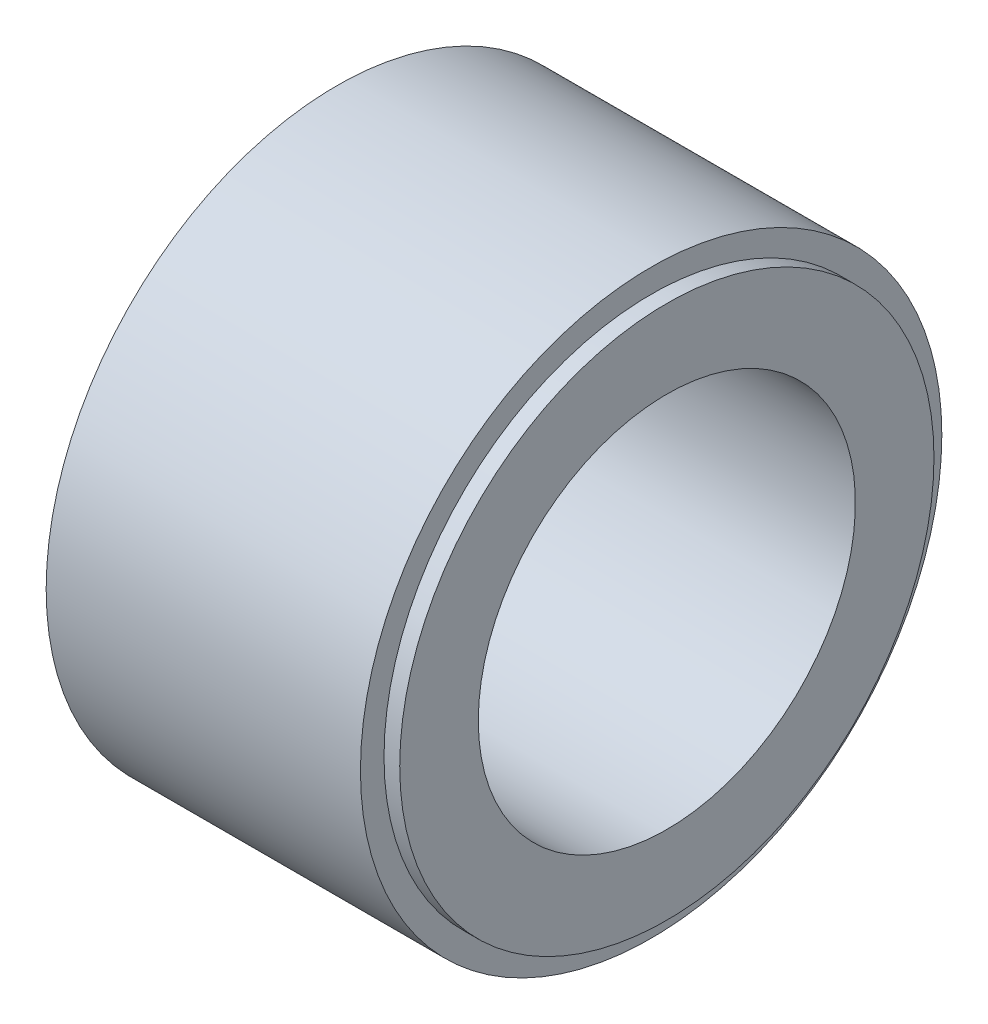
ISO-10303-21;
HEADER;
FILE_DESCRIPTION(('STEP AP214'),'2;1');
FILE_NAME('part.step','',(''),(''),'','','');
FILE_SCHEMA(('AUTOMOTIVE_DESIGN { 1 0 10303 214 1 1 1 1 }'));
ENDSEC;
DATA;
#1=APPLICATION_CONTEXT('core data for automotive mechanical design processes');
#2=APPLICATION_PROTOCOL_DEFINITION('international standard','automotive_design',2000,#1);
#3=PRODUCT_CONTEXT('',#1,'mechanical');
#4=PRODUCT('Part','Part','',(#3));
#5=PRODUCT_RELATED_PRODUCT_CATEGORY('part','',(#4));
#6=PRODUCT_DEFINITION_FORMATION('','',#4);
#7=PRODUCT_DEFINITION_CONTEXT('part definition',#1,'design');
#8=PRODUCT_DEFINITION('design','',#6,#7);
#9=PRODUCT_DEFINITION_SHAPE('','',#8);
#10=(LENGTH_UNIT() NAMED_UNIT(*) SI_UNIT(.MILLI.,.METRE.));
#11=(NAMED_UNIT(*) PLANE_ANGLE_UNIT() SI_UNIT($,.RADIAN.));
#12=(NAMED_UNIT(*) SI_UNIT($,.STERADIAN.) SOLID_ANGLE_UNIT());
#13=UNCERTAINTY_MEASURE_WITH_UNIT(LENGTH_MEASURE(1.E-05),#10,'distance_accuracy_value','');
#14=(GEOMETRIC_REPRESENTATION_CONTEXT(3) GLOBAL_UNCERTAINTY_ASSIGNED_CONTEXT((#13)) GLOBAL_UNIT_ASSIGNED_CONTEXT((#10,
#11,#12)) REPRESENTATION_CONTEXT('',''));
#15=CARTESIAN_POINT('',(0.,0.,0.));
#16=DIRECTION('',(0.,0.,1.));
#17=DIRECTION('',(1.,0.,0.));
#18=AXIS2_PLACEMENT_3D('',#15,#16,#17);
#19=CARTESIAN_POINT('',(0.,0.,0.));
#20=DIRECTION('',(-1.,0.,0.));
#21=DIRECTION('',(0.,0.,1.));
#22=AXIS2_PLACEMENT_3D('',#19,#20,#21);
#23=CYLINDRICAL_SURFACE('',#22,24.);
#24=CARTESIAN_POINT('',(44.,0.,0.));
#25=DIRECTION('',(-1.,0.,0.));
#26=DIRECTION('',(0.,0.,1.));
#27=AXIS2_PLACEMENT_3D('',#24,#25,#26);
#28=CIRCLE('',#27,24.);
#29=CARTESIAN_POINT('',(44.,0.,24.));
#30=VERTEX_POINT('',#29);
#31=EDGE_CURVE('E53',#30,#30,#28,.T.);
#32=ORIENTED_EDGE('',*,*,#31,.F.);
#33=EDGE_LOOP('',(#32));
#34=FACE_BOUND('',#33,.T.);
#35=CARTESIAN_POINT('',(4.,0.,0.));
#36=DIRECTION('',(-1.,0.,0.));
#37=DIRECTION('',(0.,0.,1.));
#38=AXIS2_PLACEMENT_3D('',#35,#36,#37);
#39=CIRCLE('',#38,24.);
#40=CARTESIAN_POINT('',(4.,0.,24.));
#41=VERTEX_POINT('',#40);
#42=EDGE_CURVE('E12',#41,#41,#39,.F.);
#43=ORIENTED_EDGE('',*,*,#42,.F.);
#44=EDGE_LOOP('',(#43));
#45=FACE_BOUND('',#44,.T.);
#46=ADVANCED_FACE('F42',(#34,#45),#23,.F.);
#47=CARTESIAN_POINT('',(0.,0.,0.));
#48=DIRECTION('',(-1.,0.,0.));
#49=DIRECTION('',(0.,0.,1.));
#50=AXIS2_PLACEMENT_3D('',#47,#48,#49);
#51=CYLINDRICAL_SURFACE('',#50,34.);
#52=CARTESIAN_POINT('',(0.,0.,0.));
#53=DIRECTION('',(-1.,0.,0.));
#54=DIRECTION('',(0.,0.,1.));
#55=AXIS2_PLACEMENT_3D('',#52,#53,#54);
#56=CIRCLE('',#55,34.);
#57=CARTESIAN_POINT('',(0.,0.,34.));
#58=VERTEX_POINT('',#57);
#59=EDGE_CURVE('E49',#58,#58,#56,.T.);
#60=ORIENTED_EDGE('',*,*,#59,.F.);
#61=EDGE_LOOP('',(#60));
#62=FACE_BOUND('',#61,.T.);
#63=CARTESIAN_POINT('',(2.,0.,0.));
#64=DIRECTION('',(1.,0.,0.));
#65=DIRECTION('',(0.,0.,-1.));
#66=AXIS2_PLACEMENT_3D('',#63,#64,#65);
#67=CIRCLE('',#66,34.);
#68=CARTESIAN_POINT('',(2.,0.,-34.));
#69=VERTEX_POINT('',#68);
#70=EDGE_CURVE('E65',#69,#69,#67,.T.);
#71=ORIENTED_EDGE('',*,*,#70,.F.);
#72=EDGE_LOOP('',(#71));
#73=FACE_BOUND('',#72,.T.);
#74=ADVANCED_FACE('F44',(#62,#73),#51,.T.);
#75=CARTESIAN_POINT('',(0.,24.,0.));
#76=DIRECTION('',(1.,0.,0.));
#77=DIRECTION('',(0.,0.,-1.));
#78=AXIS2_PLACEMENT_3D('',#75,#76,#77);
#79=PLANE('',#78);
#80=ORIENTED_EDGE('',*,*,#59,.T.);
#81=EDGE_LOOP('',(#80));
#82=FACE_BOUND('',#81,.T.);
#83=CARTESIAN_POINT('',(0.,16.4544826719043,9.49999999999999));
#84=DIRECTION('',(-1.,0.,0.));
#85=DIRECTION('',(0.,0.,1.));
#86=AXIS2_PLACEMENT_3D('',#83,#84,#85);
#87=CIRCLE('',#86,4.);
#88=CARTESIAN_POINT('',(0.,16.4544826719043,13.5));
#89=VERTEX_POINT('',#88);
#90=EDGE_CURVE('E111',#89,#89,#87,.T.);
#91=ORIENTED_EDGE('',*,*,#90,.F.);
#92=EDGE_LOOP('',(#91));
#93=FACE_BOUND('',#92,.T.);
#94=CARTESIAN_POINT('',(0.,16.4544826719043,-9.50000000000001));
#95=DIRECTION('',(-1.,0.,0.));
#96=DIRECTION('',(0.,0.,1.));
#97=AXIS2_PLACEMENT_3D('',#94,#95,#96);
#98=CIRCLE('',#97,4.);
#99=CARTESIAN_POINT('',(0.,16.4544826719043,-5.50000000000001));
#100=VERTEX_POINT('',#99);
#101=EDGE_CURVE('E105',#100,#100,#98,.T.);
#102=ORIENTED_EDGE('',*,*,#101,.F.);
#103=EDGE_LOOP('',(#102));
#104=FACE_BOUND('',#103,.T.);
#105=CARTESIAN_POINT('',(0.,0.,-19.));
#106=DIRECTION('',(-1.,0.,0.));
#107=DIRECTION('',(0.,0.,1.));
#108=AXIS2_PLACEMENT_3D('',#105,#106,#107);
#109=CIRCLE('',#108,3.99999999999999);
#110=CARTESIAN_POINT('',(0.,0.,-15.));
#111=VERTEX_POINT('',#110);
#112=EDGE_CURVE('E99',#111,#111,#109,.T.);
#113=ORIENTED_EDGE('',*,*,#112,.F.);
#114=EDGE_LOOP('',(#113));
#115=FACE_BOUND('',#114,.T.);
#116=CARTESIAN_POINT('',(0.,-16.4544826719043,-9.5));
#117=DIRECTION('',(-1.,0.,0.));
#118=DIRECTION('',(0.,0.,1.));
#119=AXIS2_PLACEMENT_3D('',#116,#117,#118);
#120=CIRCLE('',#119,4.);
#121=CARTESIAN_POINT('',(0.,-16.4544826719043,-5.5));
#122=VERTEX_POINT('',#121);
#123=EDGE_CURVE('E93',#122,#122,#120,.T.);
#124=ORIENTED_EDGE('',*,*,#123,.F.);
#125=EDGE_LOOP('',(#124));
#126=FACE_BOUND('',#125,.T.);
#127=CARTESIAN_POINT('',(0.,-16.4544826719043,9.5));
#128=DIRECTION('',(-1.,0.,0.));
#129=DIRECTION('',(0.,0.,1.));
#130=AXIS2_PLACEMENT_3D('',#127,#128,#129);
#131=CIRCLE('',#130,4.);
#132=CARTESIAN_POINT('',(0.,-16.4544826719043,13.5));
#133=VERTEX_POINT('',#132);
#134=EDGE_CURVE('E87',#133,#133,#131,.T.);
#135=ORIENTED_EDGE('',*,*,#134,.F.);
#136=EDGE_LOOP('',(#135));
#137=FACE_BOUND('',#136,.T.);
#138=CARTESIAN_POINT('',(0.,0.,0.));
#139=DIRECTION('',(-1.,0.,0.));
#140=DIRECTION('',(0.,0.,1.));
#141=AXIS2_PLACEMENT_3D('',#138,#139,#140);
#142=CIRCLE('',#141,3.);
#143=CARTESIAN_POINT('',(0.,0.,3.));
#144=VERTEX_POINT('',#143);
#145=EDGE_CURVE('E81',#144,#144,#142,.T.);
#146=ORIENTED_EDGE('',*,*,#145,.F.);
#147=EDGE_LOOP('',(#146));
#148=FACE_BOUND('',#147,.T.);
#149=CARTESIAN_POINT('',(0.,0.,19.));
#150=DIRECTION('',(-1.,0.,0.));
#151=DIRECTION('',(0.,0.,1.));
#152=AXIS2_PLACEMENT_3D('',#149,#150,#151);
#153=CIRCLE('',#152,4.);
#154=CARTESIAN_POINT('',(0.,0.,23.));
#155=VERTEX_POINT('',#154);
#156=EDGE_CURVE('E75',#155,#155,#153,.T.);
#157=ORIENTED_EDGE('',*,*,#156,.F.);
#158=EDGE_LOOP('',(#157));
#159=FACE_BOUND('',#158,.T.);
#160=ADVANCED_FACE('F127',(#82,#93,#104,#115,#126,#137,#148,#159),#79,.F.);
#161=CARTESIAN_POINT('',(44.,34.,0.));
#162=DIRECTION('',(-1.,0.,0.));
#163=DIRECTION('',(0.,0.,1.));
#164=AXIS2_PLACEMENT_3D('',#161,#162,#163);
#165=PLANE('',#164);
#166=CARTESIAN_POINT('',(44.,0.,0.));
#167=DIRECTION('',(-1.,0.,0.));
#168=DIRECTION('',(0.,0.,1.));
#169=AXIS2_PLACEMENT_3D('',#166,#167,#168);
#170=CIRCLE('',#169,34.);
#171=CARTESIAN_POINT('',(44.,0.,34.));
#172=VERTEX_POINT('',#171);
#173=EDGE_CURVE('E57',#172,#172,#170,.T.);
#174=ORIENTED_EDGE('',*,*,#173,.F.);
#175=EDGE_LOOP('',(#174));
#176=FACE_BOUND('',#175,.T.);
#177=ORIENTED_EDGE('',*,*,#31,.T.);
#178=EDGE_LOOP('',(#177));
#179=FACE_BOUND('',#178,.T.);
#180=ADVANCED_FACE('F130',(#176,#179),#165,.F.);
#181=CARTESIAN_POINT('',(0.,0.,0.));
#182=DIRECTION('',(-1.,0.,0.));
#183=DIRECTION('',(0.,0.,1.));
#184=AXIS2_PLACEMENT_3D('',#181,#182,#183);
#185=CYLINDRICAL_SURFACE('',#184,34.);
#186=CARTESIAN_POINT('',(42.,0.,0.));
#187=DIRECTION('',(-1.,0.,0.));
#188=DIRECTION('',(0.,0.,1.));
#189=AXIS2_PLACEMENT_3D('',#186,#187,#188);
#190=CIRCLE('',#189,34.);
#191=CARTESIAN_POINT('',(42.,0.,34.));
#192=VERTEX_POINT('',#191);
#193=EDGE_CURVE('E62',#192,#192,#190,.T.);
#194=ORIENTED_EDGE('',*,*,#193,.F.);
#195=EDGE_LOOP('',(#194));
#196=FACE_BOUND('',#195,.T.);
#197=ORIENTED_EDGE('',*,*,#173,.T.);
#198=EDGE_LOOP('',(#197));
#199=FACE_BOUND('',#198,.T.);
#200=ADVANCED_FACE('F170',(#196,#199),#185,.T.);
#201=CARTESIAN_POINT('',(42.,30.,0.));
#202=DIRECTION('',(-1.,0.,0.));
#203=DIRECTION('',(0.,0.,1.));
#204=AXIS2_PLACEMENT_3D('',#201,#202,#203);
#205=PLANE('',#204);
#206=CARTESIAN_POINT('',(42.,0.,0.));
#207=DIRECTION('',(-1.,0.,0.));
#208=DIRECTION('',(0.,0.,1.));
#209=AXIS2_PLACEMENT_3D('',#206,#207,#208);
#210=CIRCLE('',#209,37.);
#211=CARTESIAN_POINT('',(42.,0.,37.));
#212=VERTEX_POINT('',#211);
#213=EDGE_CURVE('E71',#212,#212,#210,.T.);
#214=ORIENTED_EDGE('',*,*,#213,.F.);
#215=EDGE_LOOP('',(#214));
#216=FACE_BOUND('',#215,.T.);
#217=ORIENTED_EDGE('',*,*,#193,.T.);
#218=EDGE_LOOP('',(#217));
#219=FACE_BOUND('',#218,.T.);
#220=ADVANCED_FACE('F174',(#216,#219),#205,.F.);
#221=CARTESIAN_POINT('',(2.,34.,0.));
#222=DIRECTION('',(1.,0.,0.));
#223=DIRECTION('',(0.,0.,-1.));
#224=AXIS2_PLACEMENT_3D('',#221,#222,#223);
#225=PLANE('',#224);
#226=CARTESIAN_POINT('',(2.,0.,0.));
#227=DIRECTION('',(-1.,0.,0.));
#228=DIRECTION('',(0.,0.,1.));
#229=AXIS2_PLACEMENT_3D('',#226,#227,#228);
#230=CIRCLE('',#229,37.);
#231=CARTESIAN_POINT('',(2.,0.,37.));
#232=VERTEX_POINT('',#231);
#233=EDGE_CURVE('E68',#232,#232,#230,.T.);
#234=ORIENTED_EDGE('',*,*,#233,.T.);
#235=EDGE_LOOP('',(#234));
#236=FACE_BOUND('',#235,.T.);
#237=ORIENTED_EDGE('',*,*,#70,.T.);
#238=EDGE_LOOP('',(#237));
#239=FACE_BOUND('',#238,.T.);
#240=ADVANCED_FACE('F178',(#236,#239),#225,.F.);
#241=CARTESIAN_POINT('',(0.,0.,0.));
#242=DIRECTION('',(-1.,0.,0.));
#243=DIRECTION('',(0.,0.,1.));
#244=AXIS2_PLACEMENT_3D('',#241,#242,#243);
#245=CYLINDRICAL_SURFACE('',#244,37.);
#246=ORIENTED_EDGE('',*,*,#233,.F.);
#247=EDGE_LOOP('',(#246));
#248=FACE_BOUND('',#247,.T.);
#249=ORIENTED_EDGE('',*,*,#213,.T.);
#250=EDGE_LOOP('',(#249));
#251=FACE_BOUND('',#250,.T.);
#252=ADVANCED_FACE('F155',(#248,#251),#245,.T.);
#253=CARTESIAN_POINT('',(4.,0.,0.));
#254=DIRECTION('',(-1.,0.,0.));
#255=DIRECTION('',(0.,0.,1.));
#256=AXIS2_PLACEMENT_3D('',#253,#254,#255);
#257=PLANE('',#256);
#258=CARTESIAN_POINT('',(4.,16.4544826719043,9.49999999999999));
#259=DIRECTION('',(-1.,0.,0.));
#260=DIRECTION('',(0.,0.,1.));
#261=AXIS2_PLACEMENT_3D('',#258,#259,#260);
#262=CIRCLE('',#261,4.);
#263=CARTESIAN_POINT('',(4.,16.4544826719043,13.5));
#264=VERTEX_POINT('',#263);
#265=EDGE_CURVE('E108',#264,#264,#262,.T.);
#266=ORIENTED_EDGE('',*,*,#265,.T.);
#267=EDGE_LOOP('',(#266));
#268=FACE_BOUND('',#267,.T.);
#269=CARTESIAN_POINT('',(4.,16.4544826719043,-9.50000000000001));
#270=DIRECTION('',(-1.,0.,0.));
#271=DIRECTION('',(0.,0.,1.));
#272=AXIS2_PLACEMENT_3D('',#269,#270,#271);
#273=CIRCLE('',#272,4.);
#274=CARTESIAN_POINT('',(4.,16.4544826719043,-5.50000000000001));
#275=VERTEX_POINT('',#274);
#276=EDGE_CURVE('E102',#275,#275,#273,.T.);
#277=ORIENTED_EDGE('',*,*,#276,.T.);
#278=EDGE_LOOP('',(#277));
#279=FACE_BOUND('',#278,.T.);
#280=CARTESIAN_POINT('',(4.,0.,-19.));
#281=DIRECTION('',(-1.,0.,0.));
#282=DIRECTION('',(0.,0.,1.));
#283=AXIS2_PLACEMENT_3D('',#280,#281,#282);
#284=CIRCLE('',#283,3.99999999999999);
#285=CARTESIAN_POINT('',(4.,0.,-15.));
#286=VERTEX_POINT('',#285);
#287=EDGE_CURVE('E96',#286,#286,#284,.T.);
#288=ORIENTED_EDGE('',*,*,#287,.T.);
#289=EDGE_LOOP('',(#288));
#290=FACE_BOUND('',#289,.T.);
#291=CARTESIAN_POINT('',(4.,-16.4544826719043,-9.5));
#292=DIRECTION('',(-1.,0.,0.));
#293=DIRECTION('',(0.,0.,1.));
#294=AXIS2_PLACEMENT_3D('',#291,#292,#293);
#295=CIRCLE('',#294,4.);
#296=CARTESIAN_POINT('',(4.,-16.4544826719043,-5.5));
#297=VERTEX_POINT('',#296);
#298=EDGE_CURVE('E90',#297,#297,#295,.T.);
#299=ORIENTED_EDGE('',*,*,#298,.T.);
#300=EDGE_LOOP('',(#299));
#301=FACE_BOUND('',#300,.T.);
#302=CARTESIAN_POINT('',(4.,-16.4544826719043,9.5));
#303=DIRECTION('',(-1.,0.,0.));
#304=DIRECTION('',(0.,0.,1.));
#305=AXIS2_PLACEMENT_3D('',#302,#303,#304);
#306=CIRCLE('',#305,4.);
#307=CARTESIAN_POINT('',(4.,-16.4544826719043,13.5));
#308=VERTEX_POINT('',#307);
#309=EDGE_CURVE('E84',#308,#308,#306,.T.);
#310=ORIENTED_EDGE('',*,*,#309,.T.);
#311=EDGE_LOOP('',(#310));
#312=FACE_BOUND('',#311,.T.);
#313=CARTESIAN_POINT('',(4.,0.,0.));
#314=DIRECTION('',(-1.,0.,0.));
#315=DIRECTION('',(0.,0.,1.));
#316=AXIS2_PLACEMENT_3D('',#313,#314,#315);
#317=CIRCLE('',#316,3.);
#318=CARTESIAN_POINT('',(4.,0.,3.));
#319=VERTEX_POINT('',#318);
#320=EDGE_CURVE('E78',#319,#319,#317,.T.);
#321=ORIENTED_EDGE('',*,*,#320,.T.);
#322=EDGE_LOOP('',(#321));
#323=FACE_BOUND('',#322,.T.);
#324=CARTESIAN_POINT('',(4.,0.,19.));
#325=DIRECTION('',(-1.,0.,0.));
#326=DIRECTION('',(0.,0.,1.));
#327=AXIS2_PLACEMENT_3D('',#324,#325,#326);
#328=CIRCLE('',#327,4.);
#329=CARTESIAN_POINT('',(4.,0.,23.));
#330=VERTEX_POINT('',#329);
#331=EDGE_CURVE('E74',#330,#330,#328,.T.);
#332=ORIENTED_EDGE('',*,*,#331,.T.);
#333=EDGE_LOOP('',(#332));
#334=FACE_BOUND('',#333,.T.);
#335=ORIENTED_EDGE('',*,*,#42,.T.);
#336=EDGE_LOOP('',(#335));
#337=FACE_BOUND('',#336,.T.);
#338=ADVANCED_FACE('F117',(#268,#279,#290,#301,#312,#323,#334,#337),#257,.F.);
#339=CARTESIAN_POINT('',(4.,0.,19.));
#340=DIRECTION('',(-1.,0.,0.));
#341=DIRECTION('',(0.,0.,1.));
#342=AXIS2_PLACEMENT_3D('',#339,#340,#341);
#343=CYLINDRICAL_SURFACE('',#342,4.);
#344=ORIENTED_EDGE('',*,*,#331,.F.);
#345=EDGE_LOOP('',(#344));
#346=FACE_BOUND('',#345,.T.);
#347=ORIENTED_EDGE('',*,*,#156,.T.);
#348=EDGE_LOOP('',(#347));
#349=FACE_BOUND('',#348,.T.);
#350=ADVANCED_FACE('F143',(#346,#349),#343,.F.);
#351=CARTESIAN_POINT('',(4.,0.,0.));
#352=DIRECTION('',(-1.,0.,0.));
#353=DIRECTION('',(0.,0.,1.));
#354=AXIS2_PLACEMENT_3D('',#351,#352,#353);
#355=CYLINDRICAL_SURFACE('',#354,3.);
#356=ORIENTED_EDGE('',*,*,#320,.F.);
#357=EDGE_LOOP('',(#356));
#358=FACE_BOUND('',#357,.T.);
#359=ORIENTED_EDGE('',*,*,#145,.T.);
#360=EDGE_LOOP('',(#359));
#361=FACE_BOUND('',#360,.T.);
#362=ADVANCED_FACE('F145',(#358,#361),#355,.F.);
#363=CARTESIAN_POINT('',(4.,-16.4544826719043,9.5));
#364=DIRECTION('',(-1.,0.,0.));
#365=DIRECTION('',(0.,0.,1.));
#366=AXIS2_PLACEMENT_3D('',#363,#364,#365);
#367=CYLINDRICAL_SURFACE('',#366,4.);
#368=ORIENTED_EDGE('',*,*,#309,.F.);
#369=EDGE_LOOP('',(#368));
#370=FACE_BOUND('',#369,.T.);
#371=ORIENTED_EDGE('',*,*,#134,.T.);
#372=EDGE_LOOP('',(#371));
#373=FACE_BOUND('',#372,.T.);
#374=ADVANCED_FACE('F152',(#370,#373),#367,.F.);
#375=CARTESIAN_POINT('',(4.,-16.4544826719043,-9.5));
#376=DIRECTION('',(-1.,0.,0.));
#377=DIRECTION('',(0.,0.,1.));
#378=AXIS2_PLACEMENT_3D('',#375,#376,#377);
#379=CYLINDRICAL_SURFACE('',#378,4.);
#380=ORIENTED_EDGE('',*,*,#298,.F.);
#381=EDGE_LOOP('',(#380));
#382=FACE_BOUND('',#381,.T.);
#383=ORIENTED_EDGE('',*,*,#123,.T.);
#384=EDGE_LOOP('',(#383));
#385=FACE_BOUND('',#384,.T.);
#386=ADVANCED_FACE('F230',(#382,#385),#379,.F.);
#387=CARTESIAN_POINT('',(4.,0.,-19.));
#388=DIRECTION('',(-1.,0.,0.));
#389=DIRECTION('',(0.,0.,1.));
#390=AXIS2_PLACEMENT_3D('',#387,#388,#389);
#391=CYLINDRICAL_SURFACE('',#390,3.99999999999999);
#392=ORIENTED_EDGE('',*,*,#287,.F.);
#393=EDGE_LOOP('',(#392));
#394=FACE_BOUND('',#393,.T.);
#395=ORIENTED_EDGE('',*,*,#112,.T.);
#396=EDGE_LOOP('',(#395));
#397=FACE_BOUND('',#396,.T.);
#398=ADVANCED_FACE('F240',(#394,#397),#391,.F.);
#399=CARTESIAN_POINT('',(4.,16.4544826719043,-9.50000000000001));
#400=DIRECTION('',(-1.,0.,0.));
#401=DIRECTION('',(0.,0.,1.));
#402=AXIS2_PLACEMENT_3D('',#399,#400,#401);
#403=CYLINDRICAL_SURFACE('',#402,4.);
#404=ORIENTED_EDGE('',*,*,#276,.F.);
#405=EDGE_LOOP('',(#404));
#406=FACE_BOUND('',#405,.T.);
#407=ORIENTED_EDGE('',*,*,#101,.T.);
#408=EDGE_LOOP('',(#407));
#409=FACE_BOUND('',#408,.T.);
#410=ADVANCED_FACE('F123',(#406,#409),#403,.F.);
#411=CARTESIAN_POINT('',(4.,16.4544826719043,9.49999999999999));
#412=DIRECTION('',(-1.,0.,0.));
#413=DIRECTION('',(0.,0.,1.));
#414=AXIS2_PLACEMENT_3D('',#411,#412,#413);
#415=CYLINDRICAL_SURFACE('',#414,4.);
#416=ORIENTED_EDGE('',*,*,#265,.F.);
#417=EDGE_LOOP('',(#416));
#418=FACE_BOUND('',#417,.T.);
#419=ORIENTED_EDGE('',*,*,#90,.T.);
#420=EDGE_LOOP('',(#419));
#421=FACE_BOUND('',#420,.T.);
#422=ADVANCED_FACE('F120',(#418,#421),#415,.F.);
#423=CLOSED_SHELL('',(#46,#74,#160,#180,#200,#220,#240,#252,#338,#350,#362,#374,#386,#398,#410,#422));
#424=MANIFOLD_SOLID_BREP('B2',#423);
#425=ADVANCED_BREP_SHAPE_REPRESENTATION('',(#18,#424),#14);
#426=SHAPE_DEFINITION_REPRESENTATION(#9,#425);
ENDSEC;
END-ISO-10303-21;
